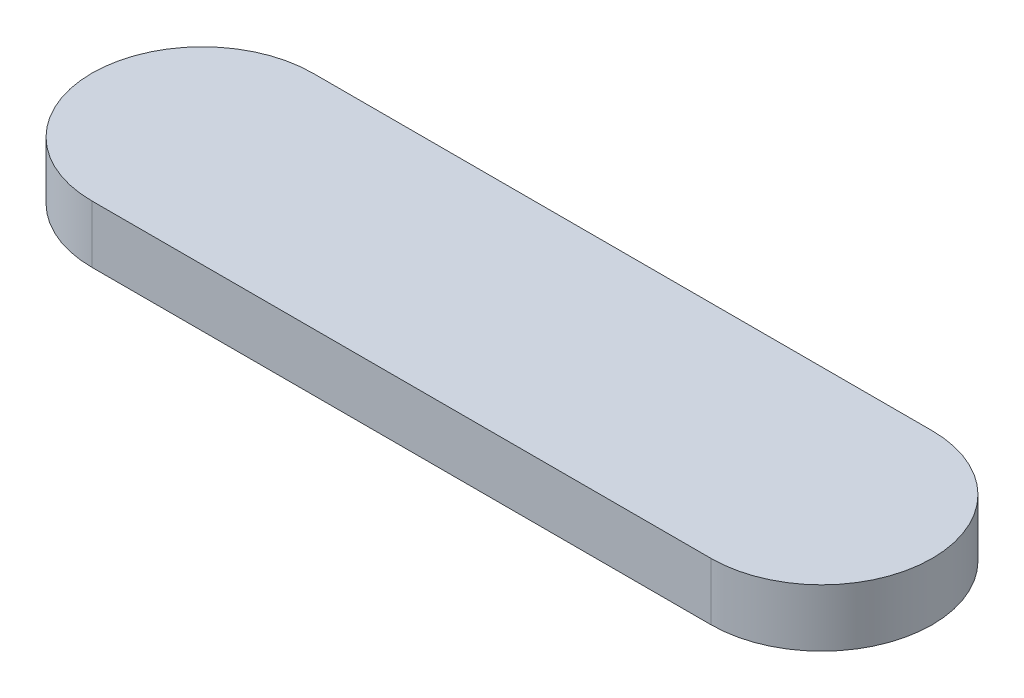
ISO-10303-21;
HEADER;
FILE_DESCRIPTION(('STEP AP214'),'2;1');
FILE_NAME('part.step','',(''),(''),'','','');
FILE_SCHEMA(('AUTOMOTIVE_DESIGN { 1 0 10303 214 1 1 1 1 }'));
ENDSEC;
DATA;
#1=APPLICATION_CONTEXT('core data for automotive mechanical design processes');
#2=APPLICATION_PROTOCOL_DEFINITION('international standard','automotive_design',2000,#1);
#3=PRODUCT_CONTEXT('',#1,'mechanical');
#4=PRODUCT('Part','Part','',(#3));
#5=PRODUCT_RELATED_PRODUCT_CATEGORY('part','',(#4));
#6=PRODUCT_DEFINITION_FORMATION('','',#4);
#7=PRODUCT_DEFINITION_CONTEXT('part definition',#1,'design');
#8=PRODUCT_DEFINITION('design','',#6,#7);
#9=PRODUCT_DEFINITION_SHAPE('','',#8);
#10=(LENGTH_UNIT() NAMED_UNIT(*) SI_UNIT(.MILLI.,.METRE.));
#11=(NAMED_UNIT(*) PLANE_ANGLE_UNIT() SI_UNIT($,.RADIAN.));
#12=(NAMED_UNIT(*) SI_UNIT($,.STERADIAN.) SOLID_ANGLE_UNIT());
#13=UNCERTAINTY_MEASURE_WITH_UNIT(LENGTH_MEASURE(1.E-05),#10,'distance_accuracy_value','');
#14=(GEOMETRIC_REPRESENTATION_CONTEXT(3) GLOBAL_UNCERTAINTY_ASSIGNED_CONTEXT((#13)) GLOBAL_UNIT_ASSIGNED_CONTEXT((#10,
#11,#12)) REPRESENTATION_CONTEXT('',''));
#15=CARTESIAN_POINT('',(0.,0.,0.));
#16=DIRECTION('',(0.,0.,1.));
#17=DIRECTION('',(1.,0.,0.));
#18=AXIS2_PLACEMENT_3D('',#15,#16,#17);
#19=CARTESIAN_POINT('',(0.,13.,0.));
#20=DIRECTION('',(0.,-1.,0.));
#21=DIRECTION('',(0.,0.,-1.));
#22=AXIS2_PLACEMENT_3D('',#19,#20,#21);
#23=CYLINDRICAL_SURFACE('',#22,25.);
#24=CARTESIAN_POINT('',(0.,0.,0.));
#25=DIRECTION('',(0.,1.,0.));
#26=DIRECTION('',(0.,0.,1.));
#27=AXIS2_PLACEMENT_3D('',#24,#25,#26);
#28=CIRCLE('',#27,25.);
#29=CARTESIAN_POINT('',(0.,0.,-25.));
#30=VERTEX_POINT('',#29);
#31=CARTESIAN_POINT('',(0.,0.,25.));
#32=VERTEX_POINT('',#31);
#33=EDGE_CURVE('E100',#30,#32,#28,.T.);
#34=ORIENTED_EDGE('',*,*,#33,.T.);
#35=DIRECTION('',(0.,-1.,0.));
#36=VECTOR('',#35,1.);
#37=CARTESIAN_POINT('',(0.,13.,25.));
#38=LINE('',#37,#36);
#39=CARTESIAN_POINT('',(0.,13.,25.));
#40=VERTEX_POINT('',#39);
#41=EDGE_CURVE('E11',#40,#32,#38,.T.);
#42=ORIENTED_EDGE('',*,*,#41,.F.);
#43=CARTESIAN_POINT('',(0.,13.,0.));
#44=DIRECTION('',(0.,1.,0.));
#45=DIRECTION('',(0.,0.,1.));
#46=AXIS2_PLACEMENT_3D('',#43,#44,#45);
#47=CIRCLE('',#46,25.);
#48=CARTESIAN_POINT('',(0.,13.,-25.));
#49=VERTEX_POINT('',#48);
#50=EDGE_CURVE('E88',#49,#40,#47,.T.);
#51=ORIENTED_EDGE('',*,*,#50,.F.);
#52=DIRECTION('',(0.,-1.,0.));
#53=VECTOR('',#52,1.);
#54=CARTESIAN_POINT('',(0.,13.,-25.));
#55=LINE('',#54,#53);
#56=EDGE_CURVE('E96',#49,#30,#55,.T.);
#57=ORIENTED_EDGE('',*,*,#56,.T.);
#58=EDGE_LOOP('',(#34,#42,#51,#57));
#59=FACE_BOUND('',#58,.T.);
#60=ADVANCED_FACE('F37',(#59),#23,.T.);
#61=CARTESIAN_POINT('',(0.,13.,25.));
#62=DIRECTION('',(0.,0.,-1.));
#63=DIRECTION('',(-1.,0.,0.));
#64=AXIS2_PLACEMENT_3D('',#61,#62,#63);
#65=PLANE('',#64);
#66=DIRECTION('',(1.,0.,0.));
#67=VECTOR('',#66,1.);
#68=CARTESIAN_POINT('',(0.,0.,25.));
#69=LINE('',#68,#67);
#70=CARTESIAN_POINT('',(140.,0.,25.));
#71=VERTEX_POINT('',#70);
#72=EDGE_CURVE('E92',#32,#71,#69,.T.);
#73=ORIENTED_EDGE('',*,*,#72,.T.);
#74=DIRECTION('',(0.,-1.,0.));
#75=VECTOR('',#74,1.);
#76=CARTESIAN_POINT('',(140.,13.,25.));
#77=LINE('',#76,#75);
#78=CARTESIAN_POINT('',(140.,13.,25.));
#79=VERTEX_POINT('',#78);
#80=EDGE_CURVE('E45',#79,#71,#77,.T.);
#81=ORIENTED_EDGE('',*,*,#80,.F.);
#82=DIRECTION('',(1.,0.,0.));
#83=VECTOR('',#82,1.);
#84=CARTESIAN_POINT('',(0.,13.,25.));
#85=LINE('',#84,#83);
#86=EDGE_CURVE('E83',#40,#79,#85,.T.);
#87=ORIENTED_EDGE('',*,*,#86,.F.);
#88=ORIENTED_EDGE('',*,*,#41,.T.);
#89=EDGE_LOOP('',(#73,#81,#87,#88));
#90=FACE_BOUND('',#89,.T.);
#91=ADVANCED_FACE('F91',(#90),#65,.F.);
#92=CARTESIAN_POINT('',(140.,13.,0.));
#93=DIRECTION('',(0.,-1.,0.));
#94=DIRECTION('',(0.,0.,-1.));
#95=AXIS2_PLACEMENT_3D('',#92,#93,#94);
#96=CYLINDRICAL_SURFACE('',#95,25.);
#97=CARTESIAN_POINT('',(140.,0.,0.));
#98=DIRECTION('',(0.,1.,0.));
#99=DIRECTION('',(0.,0.,1.));
#100=AXIS2_PLACEMENT_3D('',#97,#98,#99);
#101=CIRCLE('',#100,25.);
#102=CARTESIAN_POINT('',(140.,0.,-25.));
#103=VERTEX_POINT('',#102);
#104=EDGE_CURVE('E70',#71,#103,#101,.T.);
#105=ORIENTED_EDGE('',*,*,#104,.T.);
#106=DIRECTION('',(0.,-1.,0.));
#107=VECTOR('',#106,1.);
#108=CARTESIAN_POINT('',(140.,13.,-25.));
#109=LINE('',#108,#107);
#110=CARTESIAN_POINT('',(140.,13.,-25.));
#111=VERTEX_POINT('',#110);
#112=EDGE_CURVE('E93',#111,#103,#109,.T.);
#113=ORIENTED_EDGE('',*,*,#112,.F.);
#114=CARTESIAN_POINT('',(140.,13.,0.));
#115=DIRECTION('',(0.,1.,0.));
#116=DIRECTION('',(0.,0.,1.));
#117=AXIS2_PLACEMENT_3D('',#114,#115,#116);
#118=CIRCLE('',#117,25.);
#119=EDGE_CURVE('E86',#79,#111,#118,.T.);
#120=ORIENTED_EDGE('',*,*,#119,.F.);
#121=ORIENTED_EDGE('',*,*,#80,.T.);
#122=EDGE_LOOP('',(#105,#113,#120,#121));
#123=FACE_BOUND('',#122,.T.);
#124=ADVANCED_FACE('F94',(#123),#96,.T.);
#125=CARTESIAN_POINT('',(0.,13.,-25.));
#126=DIRECTION('',(0.,0.,1.));
#127=DIRECTION('',(1.,0.,0.));
#128=AXIS2_PLACEMENT_3D('',#125,#126,#127);
#129=PLANE('',#128);
#130=DIRECTION('',(-1.,0.,0.));
#131=VECTOR('',#130,1.);
#132=CARTESIAN_POINT('',(0.,0.,-25.));
#133=LINE('',#132,#131);
#134=EDGE_CURVE('E76',#103,#30,#133,.T.);
#135=ORIENTED_EDGE('',*,*,#134,.T.);
#136=ORIENTED_EDGE('',*,*,#56,.F.);
#137=DIRECTION('',(-1.,0.,0.));
#138=VECTOR('',#137,1.);
#139=CARTESIAN_POINT('',(0.,13.,-25.));
#140=LINE('',#139,#138);
#141=EDGE_CURVE('E53',#111,#49,#140,.T.);
#142=ORIENTED_EDGE('',*,*,#141,.F.);
#143=ORIENTED_EDGE('',*,*,#112,.T.);
#144=EDGE_LOOP('',(#135,#136,#142,#143));
#145=FACE_BOUND('',#144,.T.);
#146=ADVANCED_FACE('F107',(#145),#129,.F.);
#147=CARTESIAN_POINT('',(0.,13.,0.));
#148=DIRECTION('',(0.,1.,0.));
#149=DIRECTION('',(0.,0.,1.));
#150=AXIS2_PLACEMENT_3D('',#147,#148,#149);
#151=PLANE('',#150);
#152=ORIENTED_EDGE('',*,*,#50,.T.);
#153=ORIENTED_EDGE('',*,*,#86,.T.);
#154=ORIENTED_EDGE('',*,*,#119,.T.);
#155=ORIENTED_EDGE('',*,*,#141,.T.);
#156=EDGE_LOOP('',(#152,#153,#154,#155));
#157=FACE_BOUND('',#156,.T.);
#158=ADVANCED_FACE('F84',(#157),#151,.T.);
#159=CARTESIAN_POINT('',(0.,0.,0.));
#160=DIRECTION('',(0.,1.,0.));
#161=DIRECTION('',(0.,0.,1.));
#162=AXIS2_PLACEMENT_3D('',#159,#160,#161);
#163=PLANE('',#162);
#164=ORIENTED_EDGE('',*,*,#33,.F.);
#165=ORIENTED_EDGE('',*,*,#134,.F.);
#166=ORIENTED_EDGE('',*,*,#104,.F.);
#167=ORIENTED_EDGE('',*,*,#72,.F.);
#168=EDGE_LOOP('',(#164,#165,#166,#167));
#169=FACE_BOUND('',#168,.T.);
#170=ADVANCED_FACE('F110',(#169),#163,.F.);
#171=CLOSED_SHELL('',(#60,#91,#124,#146,#158,#170));
#172=MANIFOLD_SOLID_BREP('B2',#171);
#173=ADVANCED_BREP_SHAPE_REPRESENTATION('',(#18,#172),#14);
#174=SHAPE_DEFINITION_REPRESENTATION(#9,#173);
ENDSEC;
END-ISO-10303-21;
